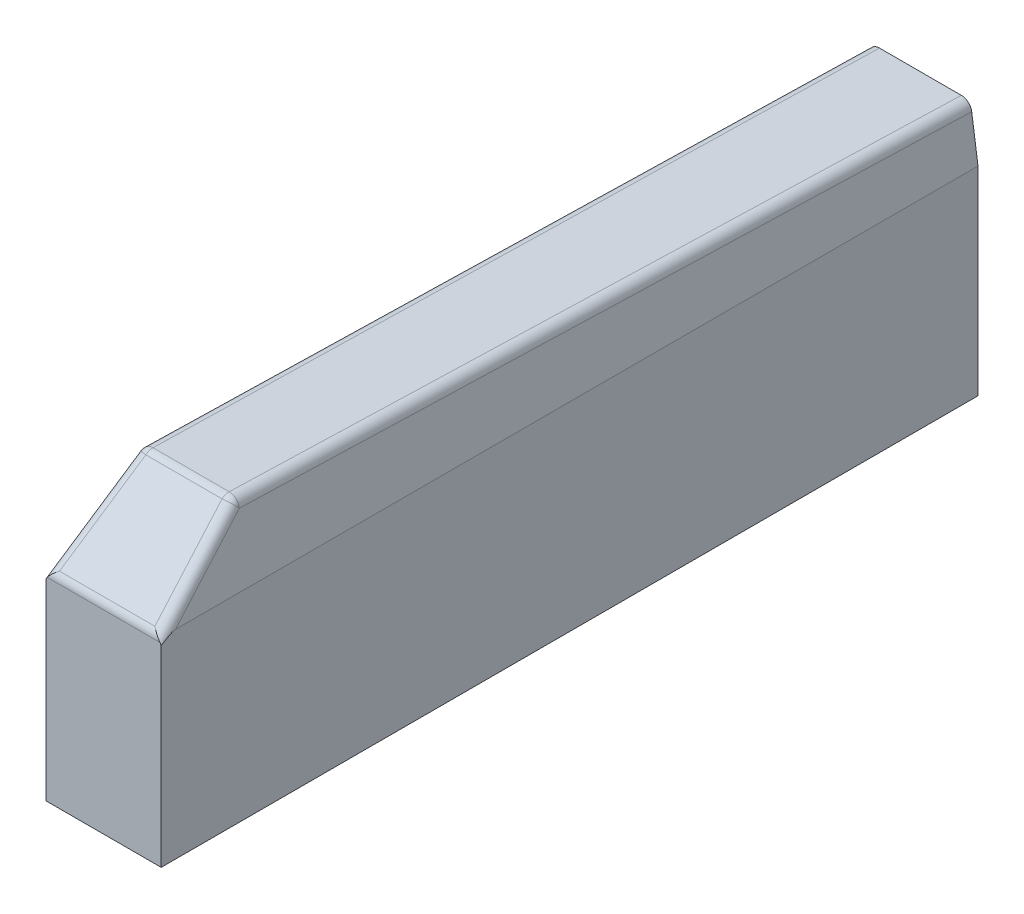
ISO-10303-21;
HEADER;
FILE_DESCRIPTION(('STEP AP214'),'2;1');
FILE_NAME('part.step','',(''),(''),'','','');
FILE_SCHEMA(('AUTOMOTIVE_DESIGN { 1 0 10303 214 1 1 1 1 }'));
ENDSEC;
DATA;
#1=APPLICATION_CONTEXT('core data for automotive mechanical design processes');
#2=APPLICATION_PROTOCOL_DEFINITION('international standard','automotive_design',2000,#1);
#3=PRODUCT_CONTEXT('',#1,'mechanical');
#4=PRODUCT('Part','Part','',(#3));
#5=PRODUCT_RELATED_PRODUCT_CATEGORY('part','',(#4));
#6=PRODUCT_DEFINITION_FORMATION('','',#4);
#7=PRODUCT_DEFINITION_CONTEXT('part definition',#1,'design');
#8=PRODUCT_DEFINITION('design','',#6,#7);
#9=PRODUCT_DEFINITION_SHAPE('','',#8);
#10=(LENGTH_UNIT() NAMED_UNIT(*) SI_UNIT(.MILLI.,.METRE.));
#11=(NAMED_UNIT(*) PLANE_ANGLE_UNIT() SI_UNIT($,.RADIAN.));
#12=(NAMED_UNIT(*) SI_UNIT($,.STERADIAN.) SOLID_ANGLE_UNIT());
#13=UNCERTAINTY_MEASURE_WITH_UNIT(LENGTH_MEASURE(1.E-05),#10,'distance_accuracy_value','');
#14=(GEOMETRIC_REPRESENTATION_CONTEXT(3) GLOBAL_UNCERTAINTY_ASSIGNED_CONTEXT((#13)) GLOBAL_UNIT_ASSIGNED_CONTEXT((#10,
#11,#12)) REPRESENTATION_CONTEXT('',''));
#15=CARTESIAN_POINT('',(0.,0.,0.));
#16=DIRECTION('',(0.,0.,1.));
#17=DIRECTION('',(1.,0.,0.));
#18=AXIS2_PLACEMENT_3D('',#15,#16,#17);
#19=CARTESIAN_POINT('',(0.,26.,0.));
#20=DIRECTION('',(1.,0.,0.));
#21=DIRECTION('',(0.,0.,-1.));
#22=AXIS2_PLACEMENT_3D('',#19,#20,#21);
#23=PLANE('',#22);
#24=DIRECTION('',(0.,-1.,0.));
#25=VECTOR('',#24,1.);
#26=CARTESIAN_POINT('',(0.,26.,0.));
#27=LINE('',#26,#25);
#28=CARTESIAN_POINT('',(0.,18.3521560896573,0.));
#29=VERTEX_POINT('',#28);
#30=CARTESIAN_POINT('',(0.,0.,0.));
#31=VERTEX_POINT('',#30);
#32=EDGE_CURVE('E152',#29,#31,#27,.T.);
#33=ORIENTED_EDGE('',*,*,#32,.F.);
#34=CARTESIAN_POINT('',(0.,11.9289321881345,6.5626280974556));
#35=DIRECTION('',(1.,0.,0.));
#36=DIRECTION('',(0.,0.658504607868518,-0.752576694706878));
#37=AXIS2_PLACEMENT_3D('',#34,#35,#36);
#38=ELLIPSE('',#37,10.6770782520313,1.);
#39=CARTESIAN_POINT('',(0.,19.,-1.35696785183373));
#40=VERTEX_POINT('',#39);
#41=EDGE_CURVE('E184',#29,#40,#38,.F.);
#42=ORIENTED_EDGE('',*,*,#41,.T.);
#43=DIRECTION('',(0.,0.,1.));
#44=VECTOR('',#43,1.);
#45=CARTESIAN_POINT('',(0.,19.,-78.));
#46=LINE('',#45,#44);
#47=CARTESIAN_POINT('',(0.,19.,-78.));
#48=VERTEX_POINT('',#47);
#49=EDGE_CURVE('E217',#48,#40,#46,.T.);
#50=ORIENTED_EDGE('',*,*,#49,.F.);
#51=DIRECTION('',(0.,-1.,0.));
#52=VECTOR('',#51,1.);
#53=CARTESIAN_POINT('',(0.,26.,-78.));
#54=LINE('',#53,#52);
#55=CARTESIAN_POINT('',(0.,0.,-78.));
#56=VERTEX_POINT('',#55);
#57=EDGE_CURVE('E150',#48,#56,#54,.T.);
#58=ORIENTED_EDGE('',*,*,#57,.T.);
#59=DIRECTION('',(0.,0.,1.));
#60=VECTOR('',#59,1.);
#61=CARTESIAN_POINT('',(0.,0.,0.));
#62=LINE('',#61,#60);
#63=EDGE_CURVE('E220',#56,#31,#62,.T.);
#64=ORIENTED_EDGE('',*,*,#63,.T.);
#65=EDGE_LOOP('',(#33,#42,#50,#58,#64));
#66=FACE_BOUND('',#65,.T.);
#67=ADVANCED_FACE('F35',(#66),#23,.F.);
#68=CARTESIAN_POINT('',(0.,26.,0.));
#69=DIRECTION('',(0.,0.,-1.));
#70=DIRECTION('',(-1.,0.,0.));
#71=AXIS2_PLACEMENT_3D('',#68,#69,#70);
#72=PLANE('',#71);
#73=DIRECTION('',(0.,-1.,0.));
#74=VECTOR('',#73,1.);
#75=CARTESIAN_POINT('',(11.,26.,0.));
#76=LINE('',#75,#74);
#77=CARTESIAN_POINT('',(11.,18.3521560896573,0.));
#78=VERTEX_POINT('',#77);
#79=CARTESIAN_POINT('',(11.,0.,0.));
#80=VERTEX_POINT('',#79);
#81=EDGE_CURVE('E149',#78,#80,#76,.T.);
#82=ORIENTED_EDGE('',*,*,#81,.F.);
#83=CARTESIAN_POINT('',(10.179671487818,17.6712317734082,0.));
#84=DIRECTION('',(0.,0.,-1.));
#85=DIRECTION('',(0.14142135623731,-0.989949493661167,0.));
#86=AXIS2_PLACEMENT_3D('',#83,#84,#85);
#87=ELLIPSE('',#86,1.33463478150391,1.);
#88=CARTESIAN_POINT('',(10.8813672932716,18.5462317734082,0.));
#89=VERTEX_POINT('',#88);
#90=EDGE_CURVE('E164',#78,#89,#87,.F.);
#91=ORIENTED_EDGE('',*,*,#90,.T.);
#92=DIRECTION('',(-1.,0.,0.));
#93=VECTOR('',#92,1.);
#94=CARTESIAN_POINT('',(0.,18.5462317734082,0.));
#95=LINE('',#94,#93);
#96=CARTESIAN_POINT('',(0.118632706728402,18.5462317734082,0.));
#97=VERTEX_POINT('',#96);
#98=EDGE_CURVE('E161',#89,#97,#95,.T.);
#99=ORIENTED_EDGE('',*,*,#98,.T.);
#100=CARTESIAN_POINT('',(0.820328512181949,17.6712317734082,0.));
#101=DIRECTION('',(0.,0.,-1.));
#102=DIRECTION('',(0.14142135623731,0.989949493661167,0.));
#103=AXIS2_PLACEMENT_3D('',#100,#101,#102);
#104=ELLIPSE('',#103,1.33463478150391,1.);
#105=EDGE_CURVE('E159',#97,#29,#104,.F.);
#106=ORIENTED_EDGE('',*,*,#105,.T.);
#107=ORIENTED_EDGE('',*,*,#32,.T.);
#108=DIRECTION('',(1.,0.,0.));
#109=VECTOR('',#108,1.);
#110=CARTESIAN_POINT('',(0.,0.,0.));
#111=LINE('',#110,#109);
#112=EDGE_CURVE('E223',#31,#80,#111,.T.);
#113=ORIENTED_EDGE('',*,*,#112,.T.);
#114=EDGE_LOOP('',(#82,#91,#99,#106,#107,#113));
#115=FACE_BOUND('',#114,.T.);
#116=ADVANCED_FACE('F276',(#115),#72,.F.);
#117=CARTESIAN_POINT('',(11.,26.,0.));
#118=DIRECTION('',(-1.,0.,0.));
#119=DIRECTION('',(0.,0.,1.));
#120=AXIS2_PLACEMENT_3D('',#117,#118,#119);
#121=PLANE('',#120);
#122=DIRECTION('',(0.,0.,1.));
#123=VECTOR('',#122,1.);
#124=CARTESIAN_POINT('',(11.,19.,-78.));
#125=LINE('',#124,#123);
#126=CARTESIAN_POINT('',(11.,19.,-78.));
#127=VERTEX_POINT('',#126);
#128=CARTESIAN_POINT('',(11.,19.,-1.35696785183374));
#129=VERTEX_POINT('',#128);
#130=EDGE_CURVE('E134',#127,#129,#125,.T.);
#131=ORIENTED_EDGE('',*,*,#130,.T.);
#132=CARTESIAN_POINT('',(11.,11.9289321881345,6.56262809745561));
#133=DIRECTION('',(-1.,0.,0.));
#134=DIRECTION('',(0.,-0.658504607868518,0.752576694706878));
#135=AXIS2_PLACEMENT_3D('',#132,#133,#134);
#136=ELLIPSE('',#135,10.6770782520313,1.);
#137=EDGE_CURVE('E178',#129,#78,#136,.F.);
#138=ORIENTED_EDGE('',*,*,#137,.T.);
#139=ORIENTED_EDGE('',*,*,#81,.T.);
#140=DIRECTION('',(0.,0.,-1.));
#141=VECTOR('',#140,1.);
#142=CARTESIAN_POINT('',(11.,0.,0.));
#143=LINE('',#142,#141);
#144=CARTESIAN_POINT('',(11.,0.,-78.));
#145=VERTEX_POINT('',#144);
#146=EDGE_CURVE('E147',#80,#145,#143,.T.);
#147=ORIENTED_EDGE('',*,*,#146,.T.);
#148=DIRECTION('',(0.,-1.,0.));
#149=VECTOR('',#148,1.);
#150=CARTESIAN_POINT('',(11.,26.,-78.));
#151=LINE('',#150,#149);
#152=EDGE_CURVE('E129',#127,#145,#151,.T.);
#153=ORIENTED_EDGE('',*,*,#152,.F.);
#154=EDGE_LOOP('',(#131,#138,#139,#147,#153));
#155=FACE_BOUND('',#154,.T.);
#156=ADVANCED_FACE('F145',(#155),#121,.F.);
#157=CARTESIAN_POINT('',(0.,26.,-78.));
#158=DIRECTION('',(0.,0.,1.));
#159=DIRECTION('',(1.,0.,0.));
#160=AXIS2_PLACEMENT_3D('',#157,#158,#159);
#161=PLANE('',#160);
#162=DIRECTION('',(1.,0.,0.));
#163=VECTOR('',#162,1.);
#164=CARTESIAN_POINT('',(0.,24.0546970982735,-78.));
#165=LINE('',#164,#163);
#166=CARTESIAN_POINT('',(1.5894483817225,24.0546970982735,-78.));
#167=VERTEX_POINT('',#166);
#168=CARTESIAN_POINT('',(9.4105516182775,24.0546970982735,-78.));
#169=VERTEX_POINT('',#168);
#170=EDGE_CURVE('E135',#167,#169,#165,.T.);
#171=ORIENTED_EDGE('',*,*,#170,.T.);
#172=CARTESIAN_POINT('',(9.41065842736139,23.0543231966048,-78.));
#173=DIRECTION('',(0.,0.,1.));
#174=DIRECTION('',(-0.14142135623731,0.989949493661167,0.));
#175=AXIS2_PLACEMENT_3D('',#172,#173,#174);
#176=ELLIPSE('',#175,1.0003815308599,1.);
#177=CARTESIAN_POINT('',(10.4006079210226,23.1957445528421,-78.));
#178=VERTEX_POINT('',#177);
#179=EDGE_CURVE('E11',#169,#178,#176,.F.);
#180=ORIENTED_EDGE('',*,*,#179,.T.);
#181=DIRECTION('',(0.14142135623731,-0.989949493661166,0.));
#182=VECTOR('',#181,1.);
#183=CARTESIAN_POINT('',(11.,19.,-78.));
#184=LINE('',#183,#182);
#185=EDGE_CURVE('E123',#178,#127,#184,.T.);
#186=ORIENTED_EDGE('',*,*,#185,.T.);
#187=ORIENTED_EDGE('',*,*,#152,.T.);
#188=DIRECTION('',(-1.,0.,0.));
#189=VECTOR('',#188,1.);
#190=CARTESIAN_POINT('',(0.,0.,-78.));
#191=LINE('',#190,#189);
#192=EDGE_CURVE('E154',#145,#56,#191,.T.);
#193=ORIENTED_EDGE('',*,*,#192,.T.);
#194=ORIENTED_EDGE('',*,*,#57,.F.);
#195=DIRECTION('',(0.14142135623731,0.989949493661166,0.));
#196=VECTOR('',#195,1.);
#197=CARTESIAN_POINT('',(1.,26.,-78.));
#198=LINE('',#197,#196);
#199=CARTESIAN_POINT('',(0.599392078977447,23.1957445528421,-78.));
#200=VERTEX_POINT('',#199);
#201=EDGE_CURVE('E143',#48,#200,#198,.T.);
#202=ORIENTED_EDGE('',*,*,#201,.T.);
#203=CARTESIAN_POINT('',(1.58934157263861,23.0543231966048,-78.));
#204=DIRECTION('',(0.,0.,1.));
#205=DIRECTION('',(-0.141421356237309,-0.989949493661167,0.));
#206=AXIS2_PLACEMENT_3D('',#203,#204,#205);
#207=ELLIPSE('',#206,1.0003815308599,1.);
#208=EDGE_CURVE('E44',#200,#167,#207,.F.);
#209=ORIENTED_EDGE('',*,*,#208,.T.);
#210=EDGE_LOOP('',(#171,#180,#186,#187,#193,#194,#202,#209));
#211=FACE_BOUND('',#210,.T.);
#212=ADVANCED_FACE('F126',(#211),#161,.F.);
#213=CARTESIAN_POINT('',(0.,0.,0.));
#214=DIRECTION('',(0.,-1.,0.));
#215=DIRECTION('',(0.,0.,-1.));
#216=AXIS2_PLACEMENT_3D('',#213,#214,#215);
#217=PLANE('',#216);
#218=ORIENTED_EDGE('',*,*,#63,.F.);
#219=ORIENTED_EDGE('',*,*,#192,.F.);
#220=ORIENTED_EDGE('',*,*,#146,.F.);
#221=ORIENTED_EDGE('',*,*,#112,.F.);
#222=EDGE_LOOP('',(#218,#219,#220,#221));
#223=FACE_BOUND('',#222,.T.);
#224=ADVANCED_FACE('F230',(#223),#217,.T.);
#225=CARTESIAN_POINT('',(1.,26.,-78.));
#226=DIRECTION('',(0.989949493661167,-0.14142135623731,0.));
#227=DIRECTION('',(0.14142135623731,0.989949493661167,0.));
#228=AXIS2_PLACEMENT_3D('',#225,#226,#227);
#229=PLANE('',#228);
#230=ORIENTED_EDGE('',*,*,#49,.T.);
#231=DIRECTION('',(0.0936585811581694,0.655610068107186,-0.749268649265355));
#232=VECTOR('',#231,1.);
#233=CARTESIAN_POINT('',(5.81705488759061,59.7193842131343,-47.8934069525587));
#234=LINE('',#233,#232);
#235=CARTESIAN_POINT('',(0.871589516262348,25.1011266138364,-8.32968398193251));
#236=VERTEX_POINT('',#235);
#237=EDGE_CURVE('E182',#40,#236,#234,.T.);
#238=ORIENTED_EDGE('',*,*,#237,.T.);
#239=DIRECTION('',(-0.00390544554297062,-0.0273381188007943,-0.99961861465038));
#240=VECTOR('',#239,1.);
#241=CARTESIAN_POINT('',(0.599697592691148,23.197883148838,-77.9218022138868));
#242=LINE('',#241,#240);
#243=EDGE_CURVE('E180',#236,#200,#242,.T.);
#244=ORIENTED_EDGE('',*,*,#243,.T.);
#245=ORIENTED_EDGE('',*,*,#201,.F.);
#246=EDGE_LOOP('',(#230,#238,#244,#245));
#247=FACE_BOUND('',#246,.T.);
#248=ADVANCED_FACE('F237',(#247),#229,.F.);
#249=CARTESIAN_POINT('',(11.,19.,-78.));
#250=DIRECTION('',(-0.989949493661167,-0.14142135623731,0.));
#251=DIRECTION('',(0.14142135623731,-0.989949493661167,0.));
#252=AXIS2_PLACEMENT_3D('',#249,#250,#251);
#253=PLANE('',#252);
#254=DIRECTION('',(-0.00390544554297062,0.0273381188007943,0.99961861465038));
#255=VECTOR('',#254,1.);
#256=CARTESIAN_POINT('',(10.4010650325533,23.1925447721268,-78.1170000170496));
#257=LINE('',#256,#255);
#258=CARTESIAN_POINT('',(10.1284104837376,25.1011266138364,-8.32968398193252));
#259=VERTEX_POINT('',#258);
#260=EDGE_CURVE('E175',#178,#259,#257,.T.);
#261=ORIENTED_EDGE('',*,*,#260,.T.);
#262=DIRECTION('',(0.0936585811581695,-0.655610068107186,0.749268649265355));
#263=VECTOR('',#262,1.);
#264=CARTESIAN_POINT('',(5.62154160363745,56.6492087745378,-44.3846350227341));
#265=LINE('',#264,#263);
#266=EDGE_CURVE('E140',#259,#129,#265,.T.);
#267=ORIENTED_EDGE('',*,*,#266,.T.);
#268=ORIENTED_EDGE('',*,*,#130,.F.);
#269=ORIENTED_EDGE('',*,*,#185,.F.);
#270=EDGE_LOOP('',(#261,#267,#268,#269));
#271=FACE_BOUND('',#270,.T.);
#272=ADVANCED_FACE('F138',(#271),#253,.F.);
#273=CARTESIAN_POINT('',(11.,26.,-8.));
#274=DIRECTION('',(0.,-0.752576694706878,-0.658504607868518));
#275=DIRECTION('',(0.,0.658504607868518,-0.752576694706878));
#276=AXIS2_PLACEMENT_3D('',#273,#274,#275);
#277=PLANE('',#276);
#278=DIRECTION('',(0.0936585811581694,0.655610068107186,-0.749268649265355));
#279=VECTOR('',#278,1.);
#280=CARTESIAN_POINT('',(1.98244297774301,26.5586097270425,-8.63841111661996));
#281=LINE('',#280,#279);
#282=CARTESIAN_POINT('',(1.86153900992351,25.712281952306,-7.67117937406401));
#283=VERTEX_POINT('',#282);
#284=CARTESIAN_POINT('',(0.945328512181947,19.298808468115,-0.341495392131479));
#285=VERTEX_POINT('',#284);
#286=EDGE_CURVE('E168',#283,#285,#281,.F.);
#287=ORIENTED_EDGE('',*,*,#286,.T.);
#288=DIRECTION('',(-1.,0.,0.));
#289=VECTOR('',#288,1.);
#290=CARTESIAN_POINT('',(11.,19.298808468115,-0.341495392131481));
#291=LINE('',#290,#289);
#292=CARTESIAN_POINT('',(10.054671487818,19.298808468115,-0.341495392131481));
#293=VERTEX_POINT('',#292);
#294=EDGE_CURVE('E172',#285,#293,#291,.F.);
#295=ORIENTED_EDGE('',*,*,#294,.T.);
#296=DIRECTION('',(0.0936585811581695,-0.655610068107186,0.749268649265355));
#297=VECTOR('',#296,1.);
#298=CARTESIAN_POINT('',(9.11404825032716,25.8831711305512,-7.86648129205856));
#299=LINE('',#298,#297);
#300=CARTESIAN_POINT('',(9.13846099007648,25.712281952306,-7.67117937406401));
#301=VERTEX_POINT('',#300);
#302=EDGE_CURVE('E170',#293,#301,#299,.F.);
#303=ORIENTED_EDGE('',*,*,#302,.T.);
#304=DIRECTION('',(-1.,0.,0.));
#305=VECTOR('',#304,1.);
#306=CARTESIAN_POINT('',(11.,25.712281952306,-7.67117937406401));
#307=LINE('',#306,#305);
#308=EDGE_CURVE('E166',#301,#283,#307,.T.);
#309=ORIENTED_EDGE('',*,*,#308,.T.);
#310=EDGE_LOOP('',(#287,#295,#303,#309));
#311=FACE_BOUND('',#310,.T.);
#312=ADVANCED_FACE('F258',(#311),#277,.F.);
#313=CARTESIAN_POINT('',(11.,24.,-80.));
#314=DIRECTION('',(0.,-0.999626238081491,0.0273383272905747));
#315=DIRECTION('',(0.,-0.0273383272905747,-0.999626238081491));
#316=AXIS2_PLACEMENT_3D('',#313,#314,#315);
#317=PLANE('',#316);
#318=DIRECTION('',(-1.,0.,0.));
#319=VECTOR('',#318,1.);
#320=CARTESIAN_POINT('',(11.,25.9593314956806,-8.3570223092231));
#321=LINE('',#320,#319);
#322=CARTESIAN_POINT('',(1.86153900992351,25.9593314956806,-8.3570223092231));
#323=VERTEX_POINT('',#322);
#324=CARTESIAN_POINT('',(9.13846099007649,25.9593314956806,-8.3570223092231));
#325=VERTEX_POINT('',#324);
#326=EDGE_CURVE('E52',#323,#325,#321,.F.);
#327=ORIENTED_EDGE('',*,*,#326,.T.);
#328=DIRECTION('',(-0.00390544554297062,0.0273381188007943,0.99961861465038));
#329=VECTOR('',#328,1.);
#330=CARTESIAN_POINT('',(9.41838961334754,23.9998311327833,-80.0061746316373));
#331=LINE('',#330,#329);
#332=EDGE_CURVE('E188',#325,#169,#331,.F.);
#333=ORIENTED_EDGE('',*,*,#332,.T.);
#334=ORIENTED_EDGE('',*,*,#170,.F.);
#335=DIRECTION('',(-0.00390544554297062,-0.0273381188007943,-0.99961861465038));
#336=VECTOR('',#335,1.);
#337=CARTESIAN_POINT('',(1.58177816420624,24.0010055756597,-79.9632311149415));
#338=LINE('',#337,#336);
#339=EDGE_CURVE('E57',#167,#323,#338,.F.);
#340=ORIENTED_EDGE('',*,*,#339,.T.);
#341=EDGE_LOOP('',(#327,#333,#334,#340));
#342=FACE_BOUND('',#341,.T.);
#343=ADVANCED_FACE('F252',(#342),#317,.F.);
#344=CARTESIAN_POINT('',(9.41111553889214,23.0511234158895,-78.1170000170496));
#345=DIRECTION('',(-0.00390544554297062,0.0273381188007943,0.99961861465038));
#346=DIRECTION('',(0.,-0.999626238081491,0.0273383272905747));
#347=AXIS2_PLACEMENT_3D('',#344,#345,#346);
#348=CYLINDRICAL_SURFACE('',#347,1.);
#349=ORIENTED_EDGE('',*,*,#179,.F.);
#350=ORIENTED_EDGE('',*,*,#332,.F.);
#351=CARTESIAN_POINT('',(9.13846099007648,24.9597052575991,-8.32968398193252));
#352=DIRECTION('',(-0.00390544554297115,0.027338118800798,0.99961861465038));
#353=DIRECTION('',(0.,-0.999626238081491,0.0273383272905783));
#354=AXIS2_PLACEMENT_3D('',#351,#352,#353);
#355=CIRCLE('',#354,1.);
#356=EDGE_CURVE('E206',#259,#325,#355,.T.);
#357=ORIENTED_EDGE('',*,*,#356,.F.);
#358=ORIENTED_EDGE('',*,*,#260,.F.);
#359=EDGE_LOOP('',(#349,#350,#357,#358));
#360=FACE_BOUND('',#359,.T.);
#361=ADVANCED_FACE('F37',(#360),#348,.T.);
#362=CARTESIAN_POINT('',(1.58964708635231,23.0564617926007,-77.9218022138868));
#363=DIRECTION('',(-0.00390544554297062,-0.0273381188007943,-0.99961861465038));
#364=DIRECTION('',(0.,0.999626238081491,-0.0273383272905747));
#365=AXIS2_PLACEMENT_3D('',#362,#363,#364);
#366=CYLINDRICAL_SURFACE('',#365,1.);
#367=ORIENTED_EDGE('',*,*,#208,.F.);
#368=ORIENTED_EDGE('',*,*,#243,.F.);
#369=CARTESIAN_POINT('',(1.86153900992351,24.9597052575991,-8.32968398193253));
#370=DIRECTION('',(0.00390544554298291,0.0273381188007945,0.99961861465038));
#371=DIRECTION('',(0.,-0.999626238081491,0.0273383272905748));
#372=AXIS2_PLACEMENT_3D('',#369,#370,#371);
#373=CIRCLE('',#372,1.);
#374=EDGE_CURVE('E204',#323,#236,#373,.T.);
#375=ORIENTED_EDGE('',*,*,#374,.F.);
#376=ORIENTED_EDGE('',*,*,#339,.F.);
#377=EDGE_LOOP('',(#367,#368,#375,#376));
#378=FACE_BOUND('',#377,.T.);
#379=ADVANCED_FACE('F251',(#378),#366,.T.);
#380=CARTESIAN_POINT('',(11.,24.9597052575991,-8.32968398193253));
#381=DIRECTION('',(-1.,0.,0.));
#382=DIRECTION('',(0.,0.,1.));
#383=AXIS2_PLACEMENT_3D('',#380,#381,#382);
#384=CYLINDRICAL_SURFACE('',#383,1.);
#385=CARTESIAN_POINT('',(9.13846099007649,24.9597052575991,-8.32968398193253));
#386=DIRECTION('',(1.,0.,0.));
#387=DIRECTION('',(0.,0.,-1.));
#388=AXIS2_PLACEMENT_3D('',#385,#386,#387);
#389=CIRCLE('',#388,1.);
#390=EDGE_CURVE('E39',#325,#301,#389,.T.);
#391=ORIENTED_EDGE('',*,*,#390,.F.);
#392=ORIENTED_EDGE('',*,*,#326,.F.);
#393=CARTESIAN_POINT('',(1.86153900992351,24.9597052575991,-8.32968398193253));
#394=DIRECTION('',(-1.,0.,0.));
#395=DIRECTION('',(0.,0.,1.));
#396=AXIS2_PLACEMENT_3D('',#393,#394,#395);
#397=CIRCLE('',#396,1.);
#398=EDGE_CURVE('E201',#283,#323,#397,.T.);
#399=ORIENTED_EDGE('',*,*,#398,.F.);
#400=ORIENTED_EDGE('',*,*,#308,.F.);
#401=EDGE_LOOP('',(#391,#392,#399,#400));
#402=FACE_BOUND('',#401,.T.);
#403=ADVANCED_FACE('F256',(#402),#384,.T.);
#404=CARTESIAN_POINT('',(9.13846099007648,24.9597052575991,-8.32968398193252));
#405=DIRECTION('',(0.,0.,1.));
#406=DIRECTION('',(1.,0.,0.));
#407=AXIS2_PLACEMENT_3D('',#404,#405,#406);
#408=SPHERICAL_SURFACE('',#407,1.);
#409=ORIENTED_EDGE('',*,*,#356,.T.);
#410=ORIENTED_EDGE('',*,*,#390,.T.);
#411=CARTESIAN_POINT('',(9.13846099007648,24.9597052575991,-8.32968398193253));
#412=DIRECTION('',(-0.0936585811581669,0.655610068107187,-0.749268649265355));
#413=DIRECTION('',(0.,0.752576694706877,0.658504607868519));
#414=AXIS2_PLACEMENT_3D('',#411,#412,#413);
#415=CIRCLE('',#414,1.);
#416=EDGE_CURVE('E198',#259,#301,#415,.F.);
#417=ORIENTED_EDGE('',*,*,#416,.F.);
#418=EDGE_LOOP('',(#409,#410,#417));
#419=FACE_BOUND('',#418,.T.);
#420=ADVANCED_FACE('F266',(#419),#408,.T.);
#421=CARTESIAN_POINT('',(1.86153900992352,24.9597052575991,-8.32968398193252));
#422=DIRECTION('',(0.,0.,1.));
#423=DIRECTION('',(1.,0.,0.));
#424=AXIS2_PLACEMENT_3D('',#421,#422,#423);
#425=SPHERICAL_SURFACE('',#424,1.);
#426=ORIENTED_EDGE('',*,*,#398,.T.);
#427=ORIENTED_EDGE('',*,*,#374,.T.);
#428=CARTESIAN_POINT('',(1.86153900992351,24.9597052575991,-8.32968398193251));
#429=DIRECTION('',(0.0936585811581686,0.65561006810718,-0.749268649265361));
#430=DIRECTION('',(0.,0.752576694706883,0.658504607868512));
#431=AXIS2_PLACEMENT_3D('',#428,#429,#430);
#432=CIRCLE('',#431,1.);
#433=EDGE_CURVE('E195',#283,#236,#432,.F.);
#434=ORIENTED_EDGE('',*,*,#433,.F.);
#435=EDGE_LOOP('',(#426,#427,#434));
#436=FACE_BOUND('',#435,.T.);
#437=ADVANCED_FACE('F246',(#436),#425,.T.);
#438=CARTESIAN_POINT('',(4.63159210997628,56.5077874183005,-44.3846350227341));
#439=DIRECTION('',(0.0936585811581695,-0.655610068107186,0.749268649265355));
#440=DIRECTION('',(0.,-0.752576694706878,-0.658504607868518));
#441=AXIS2_PLACEMENT_3D('',#438,#439,#440);
#442=CYLINDRICAL_SURFACE('',#441,1.);
#443=ORIENTED_EDGE('',*,*,#416,.T.);
#444=ORIENTED_EDGE('',*,*,#302,.F.);
#445=CARTESIAN_POINT('',(10.054671487818,18.5462317734082,-0.999999999999997));
#446=DIRECTION('',(-0.673179552141117,-0.486950373063137,0.556514712072157));
#447=DIRECTION('',(0.739479067032384,-0.443291837007791,0.506619242294618));
#448=AXIS2_PLACEMENT_3D('',#445,#446,#447);
#449=ELLIPSE('',#448,1.48548778230027,1.);
#450=EDGE_CURVE('E193',#89,#293,#449,.T.);
#451=ORIENTED_EDGE('',*,*,#450,.F.);
#452=ORIENTED_EDGE('',*,*,#90,.F.);
#453=ORIENTED_EDGE('',*,*,#137,.F.);
#454=ORIENTED_EDGE('',*,*,#266,.F.);
#455=EDGE_LOOP('',(#443,#444,#451,#452,#453,#454));
#456=FACE_BOUND('',#455,.T.);
#457=ADVANCED_FACE('F263',(#456),#442,.T.);
#458=CARTESIAN_POINT('',(6.80700438125178,59.577962856897,-47.8934069525587));
#459=DIRECTION('',(0.0936585811581694,0.655610068107186,-0.749268649265355));
#460=DIRECTION('',(0.,0.752576694706878,0.658504607868518));
#461=AXIS2_PLACEMENT_3D('',#458,#459,#460);
#462=CYLINDRICAL_SURFACE('',#461,1.);
#463=ORIENTED_EDGE('',*,*,#41,.F.);
#464=ORIENTED_EDGE('',*,*,#105,.F.);
#465=CARTESIAN_POINT('',(0.945328512181948,18.5462317734082,-0.999999999999997));
#466=DIRECTION('',(-0.673179552141117,0.486950373063137,-0.556514712072157));
#467=DIRECTION('',(0.739479067032384,0.443291837007791,-0.506619242294618));
#468=AXIS2_PLACEMENT_3D('',#465,#466,#467);
#469=ELLIPSE('',#468,1.48548778230027,1.);
#470=EDGE_CURVE('E191',#285,#97,#469,.F.);
#471=ORIENTED_EDGE('',*,*,#470,.F.);
#472=ORIENTED_EDGE('',*,*,#286,.F.);
#473=ORIENTED_EDGE('',*,*,#433,.T.);
#474=ORIENTED_EDGE('',*,*,#237,.F.);
#475=EDGE_LOOP('',(#463,#464,#471,#472,#473,#474));
#476=FACE_BOUND('',#475,.T.);
#477=ADVANCED_FACE('F240',(#476),#462,.T.);
#478=CARTESIAN_POINT('',(0.,18.5462317734082,-1.));
#479=DIRECTION('',(-1.,0.,0.));
#480=DIRECTION('',(0.,0.,1.));
#481=AXIS2_PLACEMENT_3D('',#478,#479,#480);
#482=CYLINDRICAL_SURFACE('',#481,1.);
#483=ORIENTED_EDGE('',*,*,#450,.T.);
#484=ORIENTED_EDGE('',*,*,#294,.F.);
#485=ORIENTED_EDGE('',*,*,#470,.T.);
#486=ORIENTED_EDGE('',*,*,#98,.F.);
#487=EDGE_LOOP('',(#483,#484,#485,#486));
#488=FACE_BOUND('',#487,.T.);
#489=ADVANCED_FACE('F285',(#488),#482,.T.);
#490=CLOSED_SHELL('',(#67,#116,#156,#212,#224,#248,#272,#312,#343,#361,#379,#403,#420,#437,#457,
#477,#489));
#491=MANIFOLD_SOLID_BREP('B2',#490);
#492=ADVANCED_BREP_SHAPE_REPRESENTATION('',(#18,#491),#14);
#493=SHAPE_DEFINITION_REPRESENTATION(#9,#492);
ENDSEC;
END-ISO-10303-21;
